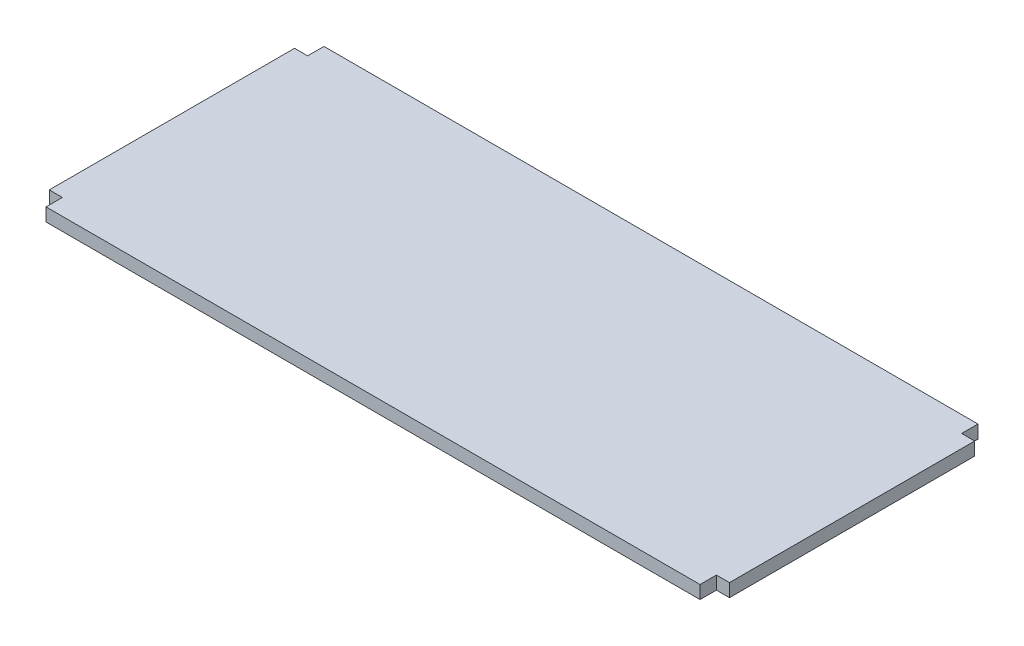
ISO-10303-21;
HEADER;
FILE_DESCRIPTION(('STEP AP214'),'2;1');
FILE_NAME('part.step','',(''),(''),'','','');
FILE_SCHEMA(('AUTOMOTIVE_DESIGN { 1 0 10303 214 1 1 1 1 }'));
ENDSEC;
DATA;
#1=APPLICATION_CONTEXT('core data for automotive mechanical design processes');
#2=APPLICATION_PROTOCOL_DEFINITION('international standard','automotive_design',2000,#1);
#3=PRODUCT_CONTEXT('',#1,'mechanical');
#4=PRODUCT('Part','Part','',(#3));
#5=PRODUCT_RELATED_PRODUCT_CATEGORY('part','',(#4));
#6=PRODUCT_DEFINITION_FORMATION('','',#4);
#7=PRODUCT_DEFINITION_CONTEXT('part definition',#1,'design');
#8=PRODUCT_DEFINITION('design','',#6,#7);
#9=PRODUCT_DEFINITION_SHAPE('','',#8);
#10=(LENGTH_UNIT() NAMED_UNIT(*) SI_UNIT(.MILLI.,.METRE.));
#11=(NAMED_UNIT(*) PLANE_ANGLE_UNIT() SI_UNIT($,.RADIAN.));
#12=(NAMED_UNIT(*) SI_UNIT($,.STERADIAN.) SOLID_ANGLE_UNIT());
#13=UNCERTAINTY_MEASURE_WITH_UNIT(LENGTH_MEASURE(1.E-05),#10,'distance_accuracy_value','');
#14=(GEOMETRIC_REPRESENTATION_CONTEXT(3) GLOBAL_UNCERTAINTY_ASSIGNED_CONTEXT((#13)) GLOBAL_UNIT_ASSIGNED_CONTEXT((#10,
#11,#12)) REPRESENTATION_CONTEXT('',''));
#15=CARTESIAN_POINT('',(0.,0.,0.));
#16=DIRECTION('',(0.,0.,1.));
#17=DIRECTION('',(1.,0.,0.));
#18=AXIS2_PLACEMENT_3D('',#15,#16,#17);
#19=CARTESIAN_POINT('',(-2.,2.,0.));
#20=DIRECTION('',(1.,0.,0.));
#21=DIRECTION('',(0.,0.,-1.));
#22=AXIS2_PLACEMENT_3D('',#19,#20,#21);
#23=PLANE('',#22);
#24=DIRECTION('',(0.,0.,1.));
#25=VECTOR('',#24,1.);
#26=CARTESIAN_POINT('',(-2.,0.,0.));
#27=LINE('',#26,#25);
#28=CARTESIAN_POINT('',(-2.,0.,-40.));
#29=VERTEX_POINT('',#28);
#30=CARTESIAN_POINT('',(-2.,0.,-2.5));
#31=VERTEX_POINT('',#30);
#32=EDGE_CURVE('E229',#29,#31,#27,.T.);
#33=ORIENTED_EDGE('',*,*,#32,.T.);
#34=DIRECTION('',(0.,-1.,0.));
#35=VECTOR('',#34,1.);
#36=CARTESIAN_POINT('',(-2.,2.,-2.5));
#37=LINE('',#36,#35);
#38=CARTESIAN_POINT('',(-2.,2.,-2.5));
#39=VERTEX_POINT('',#38);
#40=EDGE_CURVE('E11',#39,#31,#37,.T.);
#41=ORIENTED_EDGE('',*,*,#40,.F.);
#42=DIRECTION('',(0.,0.,1.));
#43=VECTOR('',#42,1.);
#44=CARTESIAN_POINT('',(-2.,2.,0.));
#45=LINE('',#44,#43);
#46=CARTESIAN_POINT('',(-2.,2.,-40.));
#47=VERTEX_POINT('',#46);
#48=EDGE_CURVE('E180',#47,#39,#45,.T.);
#49=ORIENTED_EDGE('',*,*,#48,.F.);
#50=DIRECTION('',(0.,-1.,0.));
#51=VECTOR('',#50,1.);
#52=CARTESIAN_POINT('',(-2.,2.,-40.));
#53=LINE('',#52,#51);
#54=EDGE_CURVE('E62',#47,#29,#53,.T.);
#55=ORIENTED_EDGE('',*,*,#54,.T.);
#56=EDGE_LOOP('',(#33,#41,#49,#55));
#57=FACE_BOUND('',#56,.T.);
#58=ADVANCED_FACE('F45',(#57),#23,.F.);
#59=CARTESIAN_POINT('',(0.,2.,-2.5));
#60=DIRECTION('',(0.,0.,-1.));
#61=DIRECTION('',(-1.,0.,0.));
#62=AXIS2_PLACEMENT_3D('',#59,#60,#61);
#63=PLANE('',#62);
#64=DIRECTION('',(1.,0.,0.));
#65=VECTOR('',#64,1.);
#66=CARTESIAN_POINT('',(0.,0.,-2.5));
#67=LINE('',#66,#65);
#68=CARTESIAN_POINT('',(0.,0.,-2.5));
#69=VERTEX_POINT('',#68);
#70=EDGE_CURVE('E226',#31,#69,#67,.T.);
#71=ORIENTED_EDGE('',*,*,#70,.T.);
#72=DIRECTION('',(0.,-1.,0.));
#73=VECTOR('',#72,1.);
#74=CARTESIAN_POINT('',(0.,2.,-2.5));
#75=LINE('',#74,#73);
#76=CARTESIAN_POINT('',(0.,2.,-2.5));
#77=VERTEX_POINT('',#76);
#78=EDGE_CURVE('E54',#77,#69,#75,.T.);
#79=ORIENTED_EDGE('',*,*,#78,.F.);
#80=DIRECTION('',(1.,0.,0.));
#81=VECTOR('',#80,1.);
#82=CARTESIAN_POINT('',(0.,2.,-2.5));
#83=LINE('',#82,#81);
#84=EDGE_CURVE('E112',#39,#77,#83,.T.);
#85=ORIENTED_EDGE('',*,*,#84,.F.);
#86=ORIENTED_EDGE('',*,*,#40,.T.);
#87=EDGE_LOOP('',(#71,#79,#85,#86));
#88=FACE_BOUND('',#87,.T.);
#89=ADVANCED_FACE('F227',(#88),#63,.F.);
#90=CARTESIAN_POINT('',(0.,2.,0.));
#91=DIRECTION('',(-1.,0.,0.));
#92=DIRECTION('',(0.,0.,1.));
#93=AXIS2_PLACEMENT_3D('',#90,#91,#92);
#94=PLANE('',#93);
#95=DIRECTION('',(0.,0.,-1.));
#96=VECTOR('',#95,1.);
#97=CARTESIAN_POINT('',(0.,0.,0.));
#98=LINE('',#97,#96);
#99=CARTESIAN_POINT('',(0.,0.,0.));
#100=VERTEX_POINT('',#99);
#101=EDGE_CURVE('E192',#100,#69,#98,.T.);
#102=ORIENTED_EDGE('',*,*,#101,.F.);
#103=DIRECTION('',(0.,-1.,0.));
#104=VECTOR('',#103,1.);
#105=CARTESIAN_POINT('',(0.,2.,0.));
#106=LINE('',#105,#104);
#107=CARTESIAN_POINT('',(0.,2.,0.));
#108=VERTEX_POINT('',#107);
#109=EDGE_CURVE('E219',#108,#100,#106,.T.);
#110=ORIENTED_EDGE('',*,*,#109,.F.);
#111=DIRECTION('',(0.,0.,-1.));
#112=VECTOR('',#111,1.);
#113=CARTESIAN_POINT('',(0.,2.,0.));
#114=LINE('',#113,#112);
#115=EDGE_CURVE('E167',#108,#77,#114,.T.);
#116=ORIENTED_EDGE('',*,*,#115,.T.);
#117=ORIENTED_EDGE('',*,*,#78,.T.);
#118=EDGE_LOOP('',(#102,#110,#116,#117));
#119=FACE_BOUND('',#118,.T.);
#120=ADVANCED_FACE('F224',(#119),#94,.T.);
#121=CARTESIAN_POINT('',(0.,2.,0.));
#122=DIRECTION('',(0.,0.,-1.));
#123=DIRECTION('',(-1.,0.,0.));
#124=AXIS2_PLACEMENT_3D('',#121,#122,#123);
#125=PLANE('',#124);
#126=DIRECTION('',(1.,0.,0.));
#127=VECTOR('',#126,1.);
#128=CARTESIAN_POINT('',(0.,0.,0.));
#129=LINE('',#128,#127);
#130=CARTESIAN_POINT('',(100.,0.,0.));
#131=VERTEX_POINT('',#130);
#132=EDGE_CURVE('E234',#100,#131,#129,.T.);
#133=ORIENTED_EDGE('',*,*,#132,.T.);
#134=DIRECTION('',(0.,-1.,0.));
#135=VECTOR('',#134,1.);
#136=CARTESIAN_POINT('',(100.,2.,0.));
#137=LINE('',#136,#135);
#138=CARTESIAN_POINT('',(100.,2.,0.));
#139=VERTEX_POINT('',#138);
#140=EDGE_CURVE('E215',#139,#131,#137,.T.);
#141=ORIENTED_EDGE('',*,*,#140,.F.);
#142=DIRECTION('',(1.,0.,0.));
#143=VECTOR('',#142,1.);
#144=CARTESIAN_POINT('',(0.,2.,0.));
#145=LINE('',#144,#143);
#146=EDGE_CURVE('E174',#108,#139,#145,.T.);
#147=ORIENTED_EDGE('',*,*,#146,.F.);
#148=ORIENTED_EDGE('',*,*,#109,.T.);
#149=EDGE_LOOP('',(#133,#141,#147,#148));
#150=FACE_BOUND('',#149,.T.);
#151=ADVANCED_FACE('F282',(#150),#125,.F.);
#152=CARTESIAN_POINT('',(100.,2.,0.));
#153=DIRECTION('',(-1.,0.,0.));
#154=DIRECTION('',(0.,0.,1.));
#155=AXIS2_PLACEMENT_3D('',#152,#153,#154);
#156=PLANE('',#155);
#157=DIRECTION('',(0.,0.,-1.));
#158=VECTOR('',#157,1.);
#159=CARTESIAN_POINT('',(100.,0.,0.));
#160=LINE('',#159,#158);
#161=CARTESIAN_POINT('',(100.,0.,-2.5));
#162=VERTEX_POINT('',#161);
#163=EDGE_CURVE('E237',#131,#162,#160,.T.);
#164=ORIENTED_EDGE('',*,*,#163,.T.);
#165=DIRECTION('',(0.,-1.,0.));
#166=VECTOR('',#165,1.);
#167=CARTESIAN_POINT('',(100.,2.,-2.5));
#168=LINE('',#167,#166);
#169=CARTESIAN_POINT('',(100.,2.,-2.5));
#170=VERTEX_POINT('',#169);
#171=EDGE_CURVE('E211',#170,#162,#168,.T.);
#172=ORIENTED_EDGE('',*,*,#171,.F.);
#173=DIRECTION('',(0.,0.,-1.));
#174=VECTOR('',#173,1.);
#175=CARTESIAN_POINT('',(100.,2.,0.));
#176=LINE('',#175,#174);
#177=EDGE_CURVE('E179',#139,#170,#176,.T.);
#178=ORIENTED_EDGE('',*,*,#177,.F.);
#179=ORIENTED_EDGE('',*,*,#140,.T.);
#180=EDGE_LOOP('',(#164,#172,#178,#179));
#181=FACE_BOUND('',#180,.T.);
#182=ADVANCED_FACE('F278',(#181),#156,.F.);
#183=CARTESIAN_POINT('',(0.,2.,-2.5));
#184=DIRECTION('',(0.,0.,-1.));
#185=DIRECTION('',(-1.,0.,0.));
#186=AXIS2_PLACEMENT_3D('',#183,#184,#185);
#187=PLANE('',#186);
#188=DIRECTION('',(1.,0.,0.));
#189=VECTOR('',#188,1.);
#190=CARTESIAN_POINT('',(0.,0.,-2.5));
#191=LINE('',#190,#189);
#192=CARTESIAN_POINT('',(102.,0.,-2.5));
#193=VERTEX_POINT('',#192);
#194=EDGE_CURVE('E243',#162,#193,#191,.T.);
#195=ORIENTED_EDGE('',*,*,#194,.T.);
#196=DIRECTION('',(0.,-1.,0.));
#197=VECTOR('',#196,1.);
#198=CARTESIAN_POINT('',(102.,2.,-2.5));
#199=LINE('',#198,#197);
#200=CARTESIAN_POINT('',(102.,2.,-2.5));
#201=VERTEX_POINT('',#200);
#202=EDGE_CURVE('E208',#201,#193,#199,.T.);
#203=ORIENTED_EDGE('',*,*,#202,.F.);
#204=DIRECTION('',(1.,0.,0.));
#205=VECTOR('',#204,1.);
#206=CARTESIAN_POINT('',(0.,2.,-2.5));
#207=LINE('',#206,#205);
#208=EDGE_CURVE('E275',#170,#201,#207,.T.);
#209=ORIENTED_EDGE('',*,*,#208,.F.);
#210=ORIENTED_EDGE('',*,*,#171,.T.);
#211=EDGE_LOOP('',(#195,#203,#209,#210));
#212=FACE_BOUND('',#211,.T.);
#213=ADVANCED_FACE('F272',(#212),#187,.F.);
#214=CARTESIAN_POINT('',(102.,2.,0.));
#215=DIRECTION('',(1.,0.,0.));
#216=DIRECTION('',(0.,0.,-1.));
#217=AXIS2_PLACEMENT_3D('',#214,#215,#216);
#218=PLANE('',#217);
#219=DIRECTION('',(0.,0.,1.));
#220=VECTOR('',#219,1.);
#221=CARTESIAN_POINT('',(102.,0.,0.));
#222=LINE('',#221,#220);
#223=CARTESIAN_POINT('',(102.,0.,-40.));
#224=VERTEX_POINT('',#223);
#225=EDGE_CURVE('E248',#224,#193,#222,.T.);
#226=ORIENTED_EDGE('',*,*,#225,.F.);
#227=DIRECTION('',(0.,-1.,0.));
#228=VECTOR('',#227,1.);
#229=CARTESIAN_POINT('',(102.,2.,-40.));
#230=LINE('',#229,#228);
#231=CARTESIAN_POINT('',(102.,2.,-40.));
#232=VERTEX_POINT('',#231);
#233=EDGE_CURVE('E205',#232,#224,#230,.T.);
#234=ORIENTED_EDGE('',*,*,#233,.F.);
#235=DIRECTION('',(0.,0.,1.));
#236=VECTOR('',#235,1.);
#237=CARTESIAN_POINT('',(102.,2.,0.));
#238=LINE('',#237,#236);
#239=EDGE_CURVE('E286',#232,#201,#238,.T.);
#240=ORIENTED_EDGE('',*,*,#239,.T.);
#241=ORIENTED_EDGE('',*,*,#202,.T.);
#242=EDGE_LOOP('',(#226,#234,#240,#241));
#243=FACE_BOUND('',#242,.T.);
#244=ADVANCED_FACE('F268',(#243),#218,.T.);
#245=CARTESIAN_POINT('',(0.,2.,-40.));
#246=DIRECTION('',(0.,0.,-1.));
#247=DIRECTION('',(-1.,0.,0.));
#248=AXIS2_PLACEMENT_3D('',#245,#246,#247);
#249=PLANE('',#248);
#250=DIRECTION('',(1.,0.,0.));
#251=VECTOR('',#250,1.);
#252=CARTESIAN_POINT('',(0.,0.,-40.));
#253=LINE('',#252,#251);
#254=CARTESIAN_POINT('',(100.,0.,-40.));
#255=VERTEX_POINT('',#254);
#256=EDGE_CURVE('E251',#255,#224,#253,.T.);
#257=ORIENTED_EDGE('',*,*,#256,.F.);
#258=DIRECTION('',(0.,-1.,0.));
#259=VECTOR('',#258,1.);
#260=CARTESIAN_POINT('',(100.,2.,-40.));
#261=LINE('',#260,#259);
#262=CARTESIAN_POINT('',(100.,2.,-40.));
#263=VERTEX_POINT('',#262);
#264=EDGE_CURVE('E202',#263,#255,#261,.T.);
#265=ORIENTED_EDGE('',*,*,#264,.F.);
#266=DIRECTION('',(1.,0.,0.));
#267=VECTOR('',#266,1.);
#268=CARTESIAN_POINT('',(0.,2.,-40.));
#269=LINE('',#268,#267);
#270=EDGE_CURVE('E264',#263,#232,#269,.T.);
#271=ORIENTED_EDGE('',*,*,#270,.T.);
#272=ORIENTED_EDGE('',*,*,#233,.T.);
#273=EDGE_LOOP('',(#257,#265,#271,#272));
#274=FACE_BOUND('',#273,.T.);
#275=ADVANCED_FACE('F261',(#274),#249,.T.);
#276=CARTESIAN_POINT('',(100.,0.,-42.5));
#277=VERTEX_POINT('',#276);
#278=EDGE_CURVE('E244',#255,#277,#160,.T.);
#279=ORIENTED_EDGE('',*,*,#278,.T.);
#280=DIRECTION('',(0.,-1.,0.));
#281=VECTOR('',#280,1.);
#282=CARTESIAN_POINT('',(100.,2.,-42.5));
#283=LINE('',#282,#281);
#284=CARTESIAN_POINT('',(100.,2.,-42.5));
#285=VERTEX_POINT('',#284);
#286=EDGE_CURVE('E150',#285,#277,#283,.T.);
#287=ORIENTED_EDGE('',*,*,#286,.F.);
#288=EDGE_CURVE('E159',#263,#285,#176,.T.);
#289=ORIENTED_EDGE('',*,*,#288,.F.);
#290=ORIENTED_EDGE('',*,*,#264,.T.);
#291=EDGE_LOOP('',(#279,#287,#289,#290));
#292=FACE_BOUND('',#291,.T.);
#293=ADVANCED_FACE('F320',(#292),#156,.F.);
#294=CARTESIAN_POINT('',(0.,2.,-42.5));
#295=DIRECTION('',(0.,0.,-1.));
#296=DIRECTION('',(-1.,0.,0.));
#297=AXIS2_PLACEMENT_3D('',#294,#295,#296);
#298=PLANE('',#297);
#299=DIRECTION('',(1.,0.,0.));
#300=VECTOR('',#299,1.);
#301=CARTESIAN_POINT('',(0.,0.,-42.5));
#302=LINE('',#301,#300);
#303=CARTESIAN_POINT('',(0.,0.,-42.5));
#304=VERTEX_POINT('',#303);
#305=EDGE_CURVE('E145',#304,#277,#302,.T.);
#306=ORIENTED_EDGE('',*,*,#305,.F.);
#307=DIRECTION('',(0.,-1.,0.));
#308=VECTOR('',#307,1.);
#309=CARTESIAN_POINT('',(0.,2.,-42.5));
#310=LINE('',#309,#308);
#311=CARTESIAN_POINT('',(0.,2.,-42.5));
#312=VERTEX_POINT('',#311);
#313=EDGE_CURVE('E140',#312,#304,#310,.T.);
#314=ORIENTED_EDGE('',*,*,#313,.F.);
#315=DIRECTION('',(1.,0.,0.));
#316=VECTOR('',#315,1.);
#317=CARTESIAN_POINT('',(0.,2.,-42.5));
#318=LINE('',#317,#316);
#319=EDGE_CURVE('E143',#312,#285,#318,.T.);
#320=ORIENTED_EDGE('',*,*,#319,.T.);
#321=ORIENTED_EDGE('',*,*,#286,.T.);
#322=EDGE_LOOP('',(#306,#314,#320,#321));
#323=FACE_BOUND('',#322,.T.);
#324=ADVANCED_FACE('F142',(#323),#298,.T.);
#325=CARTESIAN_POINT('',(0.,0.,-40.));
#326=VERTEX_POINT('',#325);
#327=EDGE_CURVE('E187',#326,#304,#98,.T.);
#328=ORIENTED_EDGE('',*,*,#327,.F.);
#329=DIRECTION('',(0.,-1.,0.));
#330=VECTOR('',#329,1.);
#331=CARTESIAN_POINT('',(0.,2.,-40.));
#332=LINE('',#331,#330);
#333=CARTESIAN_POINT('',(0.,2.,-40.));
#334=VERTEX_POINT('',#333);
#335=EDGE_CURVE('E100',#334,#326,#332,.T.);
#336=ORIENTED_EDGE('',*,*,#335,.F.);
#337=EDGE_CURVE('E156',#334,#312,#114,.T.);
#338=ORIENTED_EDGE('',*,*,#337,.T.);
#339=ORIENTED_EDGE('',*,*,#313,.T.);
#340=EDGE_LOOP('',(#328,#336,#338,#339));
#341=FACE_BOUND('',#340,.T.);
#342=ADVANCED_FACE('F163',(#341),#94,.T.);
#343=CARTESIAN_POINT('',(0.,2.,-40.));
#344=DIRECTION('',(0.,0.,-1.));
#345=DIRECTION('',(-1.,0.,0.));
#346=AXIS2_PLACEMENT_3D('',#343,#344,#345);
#347=PLANE('',#346);
#348=DIRECTION('',(1.,0.,0.));
#349=VECTOR('',#348,1.);
#350=CARTESIAN_POINT('',(0.,0.,-40.));
#351=LINE('',#350,#349);
#352=EDGE_CURVE('E182',#29,#326,#351,.T.);
#353=ORIENTED_EDGE('',*,*,#352,.F.);
#354=ORIENTED_EDGE('',*,*,#54,.F.);
#355=DIRECTION('',(1.,0.,0.));
#356=VECTOR('',#355,1.);
#357=CARTESIAN_POINT('',(0.,2.,-40.));
#358=LINE('',#357,#356);
#359=EDGE_CURVE('E165',#47,#334,#358,.T.);
#360=ORIENTED_EDGE('',*,*,#359,.T.);
#361=ORIENTED_EDGE('',*,*,#335,.T.);
#362=EDGE_LOOP('',(#353,#354,#360,#361));
#363=FACE_BOUND('',#362,.T.);
#364=ADVANCED_FACE('F294',(#363),#347,.T.);
#365=CARTESIAN_POINT('',(0.,2.,0.));
#366=DIRECTION('',(0.,1.,0.));
#367=DIRECTION('',(0.,0.,1.));
#368=AXIS2_PLACEMENT_3D('',#365,#366,#367);
#369=PLANE('',#368);
#370=ORIENTED_EDGE('',*,*,#48,.T.);
#371=ORIENTED_EDGE('',*,*,#84,.T.);
#372=ORIENTED_EDGE('',*,*,#115,.F.);
#373=ORIENTED_EDGE('',*,*,#146,.T.);
#374=ORIENTED_EDGE('',*,*,#177,.T.);
#375=ORIENTED_EDGE('',*,*,#208,.T.);
#376=ORIENTED_EDGE('',*,*,#239,.F.);
#377=ORIENTED_EDGE('',*,*,#270,.F.);
#378=ORIENTED_EDGE('',*,*,#288,.T.);
#379=ORIENTED_EDGE('',*,*,#319,.F.);
#380=ORIENTED_EDGE('',*,*,#337,.F.);
#381=ORIENTED_EDGE('',*,*,#359,.F.);
#382=EDGE_LOOP('',(#370,#371,#372,#373,#374,#375,#376,#377,#378,#379,#380,#381));
#383=FACE_BOUND('',#382,.T.);
#384=ADVANCED_FACE('F154',(#383),#369,.T.);
#385=CARTESIAN_POINT('',(0.,0.,0.));
#386=DIRECTION('',(0.,1.,0.));
#387=DIRECTION('',(0.,0.,1.));
#388=AXIS2_PLACEMENT_3D('',#385,#386,#387);
#389=PLANE('',#388);
#390=ORIENTED_EDGE('',*,*,#32,.F.);
#391=ORIENTED_EDGE('',*,*,#352,.T.);
#392=ORIENTED_EDGE('',*,*,#327,.T.);
#393=ORIENTED_EDGE('',*,*,#305,.T.);
#394=ORIENTED_EDGE('',*,*,#278,.F.);
#395=ORIENTED_EDGE('',*,*,#256,.T.);
#396=ORIENTED_EDGE('',*,*,#225,.T.);
#397=ORIENTED_EDGE('',*,*,#194,.F.);
#398=ORIENTED_EDGE('',*,*,#163,.F.);
#399=ORIENTED_EDGE('',*,*,#132,.F.);
#400=ORIENTED_EDGE('',*,*,#101,.T.);
#401=ORIENTED_EDGE('',*,*,#70,.F.);
#402=EDGE_LOOP('',(#390,#391,#392,#393,#394,#395,#396,#397,#398,#399,#400,#401));
#403=FACE_BOUND('',#402,.T.);
#404=ADVANCED_FACE('F232',(#403),#389,.F.);
#405=CLOSED_SHELL('',(#58,#89,#120,#151,#182,#213,#244,#275,#293,#324,#342,#364,#384,#404));
#406=MANIFOLD_SOLID_BREP('B2',#405);
#407=ADVANCED_BREP_SHAPE_REPRESENTATION('',(#18,#406),#14);
#408=SHAPE_DEFINITION_REPRESENTATION(#9,#407);
ENDSEC;
END-ISO-10303-21;
